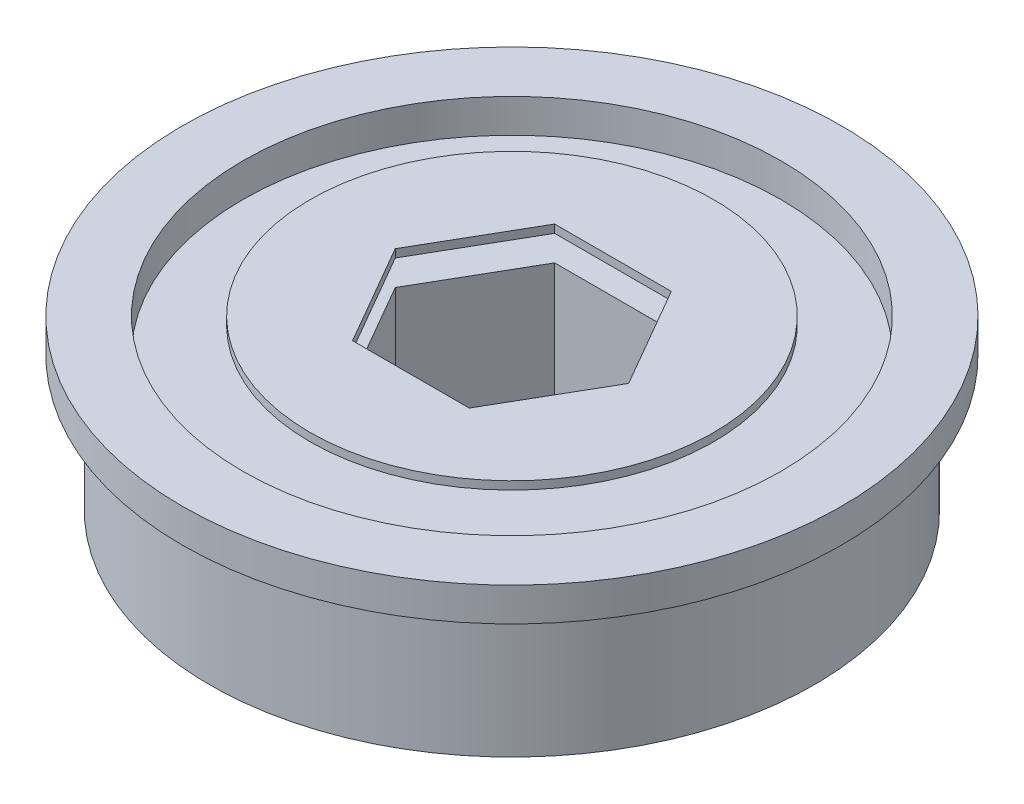
ISO-10303-21;
HEADER;
FILE_DESCRIPTION(('STEP AP214'),'2;1');
FILE_NAME('part.step','',(''),(''),'','','');
FILE_SCHEMA(('AUTOMOTIVE_DESIGN { 1 0 10303 214 1 1 1 1 }'));
ENDSEC;
DATA;
#1=APPLICATION_CONTEXT('core data for automotive mechanical design processes');
#2=APPLICATION_PROTOCOL_DEFINITION('international standard','automotive_design',2000,#1);
#3=PRODUCT_CONTEXT('',#1,'mechanical');
#4=PRODUCT('Part','Part','',(#3));
#5=PRODUCT_RELATED_PRODUCT_CATEGORY('part','',(#4));
#6=PRODUCT_DEFINITION_FORMATION('','',#4);
#7=PRODUCT_DEFINITION_CONTEXT('part definition',#1,'design');
#8=PRODUCT_DEFINITION('design','',#6,#7);
#9=PRODUCT_DEFINITION_SHAPE('','',#8);
#10=(LENGTH_UNIT() NAMED_UNIT(*) SI_UNIT(.MILLI.,.METRE.));
#11=(NAMED_UNIT(*) PLANE_ANGLE_UNIT() SI_UNIT($,.RADIAN.));
#12=(NAMED_UNIT(*) SI_UNIT($,.STERADIAN.) SOLID_ANGLE_UNIT());
#13=UNCERTAINTY_MEASURE_WITH_UNIT(LENGTH_MEASURE(1.E-05),#10,'distance_accuracy_value','');
#14=(GEOMETRIC_REPRESENTATION_CONTEXT(3) GLOBAL_UNCERTAINTY_ASSIGNED_CONTEXT((#13)) GLOBAL_UNIT_ASSIGNED_CONTEXT((#10,
#11,#12)) REPRESENTATION_CONTEXT('',''));
#15=CARTESIAN_POINT('',(0.,0.,0.));
#16=DIRECTION('',(0.,0.,1.));
#17=DIRECTION('',(1.,0.,0.));
#18=AXIS2_PLACEMENT_3D('',#15,#16,#17);
#19=CARTESIAN_POINT('',(0.,7.9375,0.));
#20=DIRECTION('',(0.,-1.,0.));
#21=DIRECTION('',(0.,0.,-1.));
#22=AXIS2_PLACEMENT_3D('',#19,#20,#21);
#23=CYLINDRICAL_SURFACE('',#22,9.525);
#24=CARTESIAN_POINT('',(0.,7.9375,0.));
#25=DIRECTION('',(0.,-1.,0.));
#26=DIRECTION('',(0.,0.,1.));
#27=AXIS2_PLACEMENT_3D('',#24,#25,#26);
#28=CIRCLE('',#27,9.525);
#29=CARTESIAN_POINT('',(0.,7.9375,9.525));
#30=VERTEX_POINT('',#29);
#31=EDGE_CURVE('E135',#30,#30,#28,.T.);
#32=ORIENTED_EDGE('',*,*,#31,.T.);
#33=EDGE_LOOP('',(#32));
#34=FACE_BOUND('',#33,.T.);
#35=CARTESIAN_POINT('',(0.,7.5565,0.));
#36=DIRECTION('',(0.,-1.,0.));
#37=DIRECTION('',(0.,0.,1.));
#38=AXIS2_PLACEMENT_3D('',#35,#36,#37);
#39=CIRCLE('',#38,9.525);
#40=CARTESIAN_POINT('',(0.,7.5565,9.525));
#41=VERTEX_POINT('',#40);
#42=EDGE_CURVE('E124',#41,#41,#39,.T.);
#43=ORIENTED_EDGE('',*,*,#42,.F.);
#44=EDGE_LOOP('',(#43));
#45=FACE_BOUND('',#44,.T.);
#46=ADVANCED_FACE('F43',(#34,#45),#23,.T.);
#47=CARTESIAN_POINT('',(0.,7.9375,0.));
#48=DIRECTION('',(0.,1.,0.));
#49=DIRECTION('',(0.,0.,1.));
#50=AXIS2_PLACEMENT_3D('',#47,#48,#49);
#51=PLANE('',#50);
#52=DIRECTION('',(-0.5,0.,-0.866025403784439));
#53=VECTOR('',#52,1.);
#54=CARTESIAN_POINT('',(-2.75396078403451,7.9375,4.77));
#55=LINE('',#54,#53);
#56=CARTESIAN_POINT('',(-2.75396078403451,7.9375,4.77));
#57=VERTEX_POINT('',#56);
#58=CARTESIAN_POINT('',(-5.50792156806903,7.9375,0.));
#59=VERTEX_POINT('',#58);
#60=EDGE_CURVE('E98',#57,#59,#55,.T.);
#61=ORIENTED_EDGE('',*,*,#60,.T.);
#62=DIRECTION('',(0.5,0.,-0.866025403784439));
#63=VECTOR('',#62,1.);
#64=CARTESIAN_POINT('',(-5.50792156806903,7.9375,0.));
#65=LINE('',#64,#63);
#66=CARTESIAN_POINT('',(-2.75396078403451,7.9375,-4.77));
#67=VERTEX_POINT('',#66);
#68=EDGE_CURVE('E105',#59,#67,#65,.T.);
#69=ORIENTED_EDGE('',*,*,#68,.T.);
#70=DIRECTION('',(1.,0.,0.));
#71=VECTOR('',#70,1.);
#72=CARTESIAN_POINT('',(-2.75396078403451,7.9375,-4.77));
#73=LINE('',#72,#71);
#74=CARTESIAN_POINT('',(2.75396078403452,7.9375,-4.77));
#75=VERTEX_POINT('',#74);
#76=EDGE_CURVE('E57',#67,#75,#73,.T.);
#77=ORIENTED_EDGE('',*,*,#76,.T.);
#78=DIRECTION('',(0.5,0.,0.866025403784439));
#79=VECTOR('',#78,1.);
#80=CARTESIAN_POINT('',(2.75396078403452,7.9375,-4.77));
#81=LINE('',#80,#79);
#82=CARTESIAN_POINT('',(5.50792156806903,7.9375,0.));
#83=VERTEX_POINT('',#82);
#84=EDGE_CURVE('E116',#75,#83,#81,.T.);
#85=ORIENTED_EDGE('',*,*,#84,.T.);
#86=DIRECTION('',(-0.5,0.,0.866025403784439));
#87=VECTOR('',#86,1.);
#88=CARTESIAN_POINT('',(5.50792156806903,7.9375,0.));
#89=LINE('',#88,#87);
#90=CARTESIAN_POINT('',(2.75396078403451,7.9375,4.77));
#91=VERTEX_POINT('',#90);
#92=EDGE_CURVE('E119',#83,#91,#89,.T.);
#93=ORIENTED_EDGE('',*,*,#92,.T.);
#94=DIRECTION('',(-1.,0.,0.));
#95=VECTOR('',#94,1.);
#96=CARTESIAN_POINT('',(2.75396078403451,7.9375,4.77));
#97=LINE('',#96,#95);
#98=EDGE_CURVE('E102',#91,#57,#97,.T.);
#99=ORIENTED_EDGE('',*,*,#98,.T.);
#100=EDGE_LOOP('',(#61,#69,#77,#85,#93,#99));
#101=FACE_BOUND('',#100,.T.);
#102=ORIENTED_EDGE('',*,*,#31,.F.);
#103=EDGE_LOOP('',(#102));
#104=FACE_BOUND('',#103,.T.);
#105=ADVANCED_FACE('F109',(#101,#104),#51,.T.);
#106=CARTESIAN_POINT('',(0.,7.5565,0.));
#107=DIRECTION('',(0.,1.,0.));
#108=DIRECTION('',(0.,0.,1.));
#109=AXIS2_PLACEMENT_3D('',#106,#107,#108);
#110=PLANE('',#109);
#111=DIRECTION('',(-0.5,0.,0.866025403784439));
#112=VECTOR('',#111,1.);
#113=CARTESIAN_POINT('',(-4.13094117605177,7.5565,-2.385));
#114=LINE('',#113,#112);
#115=CARTESIAN_POINT('',(-2.75396078403451,7.5565,-4.77));
#116=VERTEX_POINT('',#115);
#117=CARTESIAN_POINT('',(-5.50792156806903,7.5565,0.));
#118=VERTEX_POINT('',#117);
#119=EDGE_CURVE('E138',#116,#118,#114,.T.);
#120=ORIENTED_EDGE('',*,*,#119,.T.);
#121=DIRECTION('',(0.5,0.,0.866025403784439));
#122=VECTOR('',#121,1.);
#123=CARTESIAN_POINT('',(-4.13094117605177,7.5565,2.385));
#124=LINE('',#123,#122);
#125=CARTESIAN_POINT('',(-2.75396078403451,7.5565,4.77));
#126=VERTEX_POINT('',#125);
#127=EDGE_CURVE('E12',#118,#126,#124,.T.);
#128=ORIENTED_EDGE('',*,*,#127,.T.);
#129=DIRECTION('',(1.,0.,0.));
#130=VECTOR('',#129,1.);
#131=CARTESIAN_POINT('',(0.,7.5565,4.77));
#132=LINE('',#131,#130);
#133=CARTESIAN_POINT('',(2.75396078403451,7.5565,4.77));
#134=VERTEX_POINT('',#133);
#135=EDGE_CURVE('E50',#126,#134,#132,.T.);
#136=ORIENTED_EDGE('',*,*,#135,.T.);
#137=DIRECTION('',(0.5,0.,-0.866025403784439));
#138=VECTOR('',#137,1.);
#139=CARTESIAN_POINT('',(4.13094117605177,7.5565,2.385));
#140=LINE('',#139,#138);
#141=CARTESIAN_POINT('',(5.50792156806903,7.5565,0.));
#142=VERTEX_POINT('',#141);
#143=EDGE_CURVE('E148',#134,#142,#140,.T.);
#144=ORIENTED_EDGE('',*,*,#143,.T.);
#145=DIRECTION('',(-0.5,0.,-0.866025403784439));
#146=VECTOR('',#145,1.);
#147=CARTESIAN_POINT('',(4.13094117605177,7.5565,-2.385));
#148=LINE('',#147,#146);
#149=CARTESIAN_POINT('',(2.75396078403452,7.5565,-4.77));
#150=VERTEX_POINT('',#149);
#151=EDGE_CURVE('E145',#142,#150,#148,.T.);
#152=ORIENTED_EDGE('',*,*,#151,.T.);
#153=DIRECTION('',(-1.,0.,0.));
#154=VECTOR('',#153,1.);
#155=CARTESIAN_POINT('',(0.,7.5565,-4.77));
#156=LINE('',#155,#154);
#157=EDGE_CURVE('E142',#150,#116,#156,.T.);
#158=ORIENTED_EDGE('',*,*,#157,.T.);
#159=EDGE_LOOP('',(#120,#128,#136,#144,#152,#158));
#160=FACE_BOUND('',#159,.T.);
#161=ORIENTED_EDGE('',*,*,#42,.T.);
#162=EDGE_LOOP('',(#161));
#163=FACE_BOUND('',#162,.T.);
#164=ADVANCED_FACE('F152',(#160,#163),#110,.F.);
#165=CARTESIAN_POINT('',(-2.75396078403451,7.9375,4.77));
#166=DIRECTION('',(-0.866025403784439,0.,0.5));
#167=DIRECTION('',(0.5,0.,0.866025403784439));
#168=AXIS2_PLACEMENT_3D('',#165,#166,#167);
#169=PLANE('',#168);
#170=DIRECTION('',(0.,-1.,0.));
#171=VECTOR('',#170,1.);
#172=CARTESIAN_POINT('',(-5.50792156806903,7.9375,0.));
#173=LINE('',#172,#171);
#174=EDGE_CURVE('E65',#59,#118,#173,.T.);
#175=ORIENTED_EDGE('',*,*,#174,.F.);
#176=ORIENTED_EDGE('',*,*,#60,.F.);
#177=DIRECTION('',(0.,-1.,0.));
#178=VECTOR('',#177,1.);
#179=CARTESIAN_POINT('',(-2.75396078403451,7.9375,4.77));
#180=LINE('',#179,#178);
#181=EDGE_CURVE('E122',#57,#126,#180,.T.);
#182=ORIENTED_EDGE('',*,*,#181,.T.);
#183=ORIENTED_EDGE('',*,*,#127,.F.);
#184=EDGE_LOOP('',(#175,#176,#182,#183));
#185=FACE_BOUND('',#184,.T.);
#186=ADVANCED_FACE('F95',(#185),#169,.F.);
#187=CARTESIAN_POINT('',(2.75396078403451,7.9375,4.77));
#188=DIRECTION('',(0.,0.,1.));
#189=DIRECTION('',(1.,0.,0.));
#190=AXIS2_PLACEMENT_3D('',#187,#188,#189);
#191=PLANE('',#190);
#192=ORIENTED_EDGE('',*,*,#181,.F.);
#193=ORIENTED_EDGE('',*,*,#98,.F.);
#194=DIRECTION('',(0.,-1.,0.));
#195=VECTOR('',#194,1.);
#196=CARTESIAN_POINT('',(2.75396078403451,7.9375,4.77));
#197=LINE('',#196,#195);
#198=EDGE_CURVE('E125',#91,#134,#197,.T.);
#199=ORIENTED_EDGE('',*,*,#198,.T.);
#200=ORIENTED_EDGE('',*,*,#135,.F.);
#201=EDGE_LOOP('',(#192,#193,#199,#200));
#202=FACE_BOUND('',#201,.T.);
#203=ADVANCED_FACE('F155',(#202),#191,.F.);
#204=CARTESIAN_POINT('',(5.50792156806903,7.9375,0.));
#205=DIRECTION('',(0.866025403784439,0.,0.5));
#206=DIRECTION('',(0.5,0.,-0.866025403784439));
#207=AXIS2_PLACEMENT_3D('',#204,#205,#206);
#208=PLANE('',#207);
#209=ORIENTED_EDGE('',*,*,#198,.F.);
#210=ORIENTED_EDGE('',*,*,#92,.F.);
#211=DIRECTION('',(0.,-1.,0.));
#212=VECTOR('',#211,1.);
#213=CARTESIAN_POINT('',(5.50792156806903,7.9375,0.));
#214=LINE('',#213,#212);
#215=EDGE_CURVE('E128',#83,#142,#214,.T.);
#216=ORIENTED_EDGE('',*,*,#215,.T.);
#217=ORIENTED_EDGE('',*,*,#143,.F.);
#218=EDGE_LOOP('',(#209,#210,#216,#217));
#219=FACE_BOUND('',#218,.T.);
#220=ADVANCED_FACE('F158',(#219),#208,.F.);
#221=CARTESIAN_POINT('',(2.75396078403452,7.9375,-4.77));
#222=DIRECTION('',(0.866025403784439,0.,-0.5));
#223=DIRECTION('',(-0.5,0.,-0.866025403784439));
#224=AXIS2_PLACEMENT_3D('',#221,#222,#223);
#225=PLANE('',#224);
#226=ORIENTED_EDGE('',*,*,#215,.F.);
#227=ORIENTED_EDGE('',*,*,#84,.F.);
#228=DIRECTION('',(0.,-1.,0.));
#229=VECTOR('',#228,1.);
#230=CARTESIAN_POINT('',(2.75396078403452,7.9375,-4.77));
#231=LINE('',#230,#229);
#232=EDGE_CURVE('E131',#75,#150,#231,.T.);
#233=ORIENTED_EDGE('',*,*,#232,.T.);
#234=ORIENTED_EDGE('',*,*,#151,.F.);
#235=EDGE_LOOP('',(#226,#227,#233,#234));
#236=FACE_BOUND('',#235,.T.);
#237=ADVANCED_FACE('F161',(#236),#225,.F.);
#238=CARTESIAN_POINT('',(-2.75396078403451,7.9375,-4.77));
#239=DIRECTION('',(0.,0.,-1.));
#240=DIRECTION('',(-1.,0.,0.));
#241=AXIS2_PLACEMENT_3D('',#238,#239,#240);
#242=PLANE('',#241);
#243=ORIENTED_EDGE('',*,*,#232,.F.);
#244=ORIENTED_EDGE('',*,*,#76,.F.);
#245=DIRECTION('',(0.,-1.,0.));
#246=VECTOR('',#245,1.);
#247=CARTESIAN_POINT('',(-2.75396078403451,7.9375,-4.77));
#248=LINE('',#247,#246);
#249=EDGE_CURVE('E101',#67,#116,#248,.T.);
#250=ORIENTED_EDGE('',*,*,#249,.T.);
#251=ORIENTED_EDGE('',*,*,#157,.F.);
#252=EDGE_LOOP('',(#243,#244,#250,#251));
#253=FACE_BOUND('',#252,.T.);
#254=ADVANCED_FACE('F162',(#253),#242,.F.);
#255=CARTESIAN_POINT('',(-5.50792156806903,7.9375,0.));
#256=DIRECTION('',(-0.866025403784438,0.,-0.5));
#257=DIRECTION('',(-0.5,0.,0.866025403784439));
#258=AXIS2_PLACEMENT_3D('',#255,#256,#257);
#259=PLANE('',#258);
#260=ORIENTED_EDGE('',*,*,#249,.F.);
#261=ORIENTED_EDGE('',*,*,#68,.F.);
#262=ORIENTED_EDGE('',*,*,#174,.T.);
#263=ORIENTED_EDGE('',*,*,#119,.F.);
#264=EDGE_LOOP('',(#260,#261,#262,#263));
#265=FACE_BOUND('',#264,.T.);
#266=ADVANCED_FACE('F106',(#265),#259,.F.);
#267=CLOSED_SHELL('',(#46,#105,#164,#186,#203,#220,#237,#254,#266));
#268=MANIFOLD_SOLID_BREP('B2',#267);
#269=CARTESIAN_POINT('',(0.,6.35,0.));
#270=DIRECTION('',(0.,1.,0.));
#271=DIRECTION('',(0.,0.,1.));
#272=AXIS2_PLACEMENT_3D('',#269,#270,#271);
#273=CYLINDRICAL_SURFACE('',#272,15.5575);
#274=CARTESIAN_POINT('',(0.,6.35,0.));
#275=DIRECTION('',(0.,1.,0.));
#276=DIRECTION('',(0.,0.,1.));
#277=AXIS2_PLACEMENT_3D('',#274,#275,#276);
#278=CIRCLE('',#277,15.5575);
#279=CARTESIAN_POINT('',(0.,6.35,15.5575));
#280=VERTEX_POINT('',#279);
#281=EDGE_CURVE('E41',#280,#280,#278,.T.);
#282=ORIENTED_EDGE('',*,*,#281,.T.);
#283=EDGE_LOOP('',(#282));
#284=FACE_BOUND('',#283,.T.);
#285=CARTESIAN_POINT('',(0.,7.9375,0.));
#286=DIRECTION('',(0.,1.,0.));
#287=DIRECTION('',(0.,0.,1.));
#288=AXIS2_PLACEMENT_3D('',#285,#286,#287);
#289=CIRCLE('',#288,15.5575);
#290=CARTESIAN_POINT('',(0.,7.9375,15.5575));
#291=VERTEX_POINT('',#290);
#292=EDGE_CURVE('E247',#291,#291,#289,.T.);
#293=ORIENTED_EDGE('',*,*,#292,.F.);
#294=EDGE_LOOP('',(#293));
#295=FACE_BOUND('',#294,.T.);
#296=ADVANCED_FACE('F240',(#284,#295),#273,.T.);
#297=CARTESIAN_POINT('',(15.5575,6.35,0.));
#298=DIRECTION('',(0.,-1.,0.));
#299=DIRECTION('',(0.,0.,-1.));
#300=AXIS2_PLACEMENT_3D('',#297,#298,#299);
#301=PLANE('',#300);
#302=CARTESIAN_POINT('',(0.,6.35,0.));
#303=DIRECTION('',(0.,-1.,0.));
#304=DIRECTION('',(0.,0.,-1.));
#305=AXIS2_PLACEMENT_3D('',#302,#303,#304);
#306=CIRCLE('',#305,14.2748);
#307=CARTESIAN_POINT('',(0.,6.35,-14.2748));
#308=VERTEX_POINT('',#307);
#309=EDGE_CURVE('E346',#308,#308,#306,.T.);
#310=ORIENTED_EDGE('',*,*,#309,.F.);
#311=EDGE_LOOP('',(#310));
#312=FACE_BOUND('',#311,.T.);
#313=ORIENTED_EDGE('',*,*,#281,.F.);
#314=EDGE_LOOP('',(#313));
#315=FACE_BOUND('',#314,.T.);
#316=ADVANCED_FACE('F363',(#312,#315),#301,.T.);
#317=CARTESIAN_POINT('',(0.,7.9375,0.));
#318=DIRECTION('',(0.,1.,0.));
#319=DIRECTION('',(0.,0.,1.));
#320=AXIS2_PLACEMENT_3D('',#317,#318,#319);
#321=PLANE('',#320);
#322=CARTESIAN_POINT('',(0.,7.9375,0.));
#323=DIRECTION('',(0.,1.,0.));
#324=DIRECTION('',(0.,0.,1.));
#325=AXIS2_PLACEMENT_3D('',#322,#323,#324);
#326=CIRCLE('',#325,12.7);
#327=CARTESIAN_POINT('',(0.,7.9375,12.7));
#328=VERTEX_POINT('',#327);
#329=EDGE_CURVE('E350',#328,#328,#326,.T.);
#330=ORIENTED_EDGE('',*,*,#329,.F.);
#331=EDGE_LOOP('',(#330));
#332=FACE_BOUND('',#331,.T.);
#333=ORIENTED_EDGE('',*,*,#292,.T.);
#334=EDGE_LOOP('',(#333));
#335=FACE_BOUND('',#334,.T.);
#336=ADVANCED_FACE('F360',(#332,#335),#321,.T.);
#337=CARTESIAN_POINT('',(0.,7.9375,0.));
#338=DIRECTION('',(0.,1.,0.));
#339=DIRECTION('',(0.,0.,1.));
#340=AXIS2_PLACEMENT_3D('',#337,#338,#339);
#341=CYLINDRICAL_SURFACE('',#340,12.7);
#342=CARTESIAN_POINT('',(0.,6.34999999999999,0.));
#343=DIRECTION('',(0.,1.,0.));
#344=DIRECTION('',(0.,0.,1.));
#345=AXIS2_PLACEMENT_3D('',#342,#343,#344);
#346=CIRCLE('',#345,12.7);
#347=CARTESIAN_POINT('',(0.,6.34999999999999,12.7));
#348=VERTEX_POINT('',#347);
#349=EDGE_CURVE('E355',#348,#348,#346,.T.);
#350=ORIENTED_EDGE('',*,*,#349,.F.);
#351=EDGE_LOOP('',(#350));
#352=FACE_BOUND('',#351,.T.);
#353=ORIENTED_EDGE('',*,*,#329,.T.);
#354=EDGE_LOOP('',(#353));
#355=FACE_BOUND('',#354,.T.);
#356=ADVANCED_FACE('F374',(#352,#355),#341,.F.);
#357=CARTESIAN_POINT('',(0.,6.35,0.));
#358=DIRECTION('',(0.,-1.,0.));
#359=DIRECTION('',(0.,0.,-1.));
#360=AXIS2_PLACEMENT_3D('',#357,#358,#359);
#361=PLANE('',#360);
#362=DIRECTION('',(-1.,0.,0.));
#363=VECTOR('',#362,1.);
#364=CARTESIAN_POINT('',(0.,6.35,4.77));
#365=LINE('',#364,#363);
#366=CARTESIAN_POINT('',(2.75396078403451,6.35,4.77));
#367=VERTEX_POINT('',#366);
#368=CARTESIAN_POINT('',(-2.75396078403451,6.35,4.77));
#369=VERTEX_POINT('',#368);
#370=EDGE_CURVE('E340',#367,#369,#365,.T.);
#371=ORIENTED_EDGE('',*,*,#370,.T.);
#372=DIRECTION('',(-0.5,0.,-0.866025403784439));
#373=VECTOR('',#372,1.);
#374=CARTESIAN_POINT('',(-4.13094117605177,6.35,2.385));
#375=LINE('',#374,#373);
#376=CARTESIAN_POINT('',(-5.50792156806903,6.35,0.));
#377=VERTEX_POINT('',#376);
#378=EDGE_CURVE('E343',#369,#377,#375,.T.);
#379=ORIENTED_EDGE('',*,*,#378,.T.);
#380=DIRECTION('',(0.5,0.,-0.866025403784439));
#381=VECTOR('',#380,1.);
#382=CARTESIAN_POINT('',(-4.13094117605177,6.35,-2.385));
#383=LINE('',#382,#381);
#384=CARTESIAN_POINT('',(-2.75396078403451,6.35,-4.77));
#385=VERTEX_POINT('',#384);
#386=EDGE_CURVE('E325',#377,#385,#383,.T.);
#387=ORIENTED_EDGE('',*,*,#386,.T.);
#388=DIRECTION('',(1.,0.,0.));
#389=VECTOR('',#388,1.);
#390=CARTESIAN_POINT('',(0.,6.35,-4.77));
#391=LINE('',#390,#389);
#392=CARTESIAN_POINT('',(2.75396078403452,6.35,-4.77));
#393=VERTEX_POINT('',#392);
#394=EDGE_CURVE('E298',#385,#393,#391,.T.);
#395=ORIENTED_EDGE('',*,*,#394,.T.);
#396=DIRECTION('',(0.5,0.,0.866025403784439));
#397=VECTOR('',#396,1.);
#398=CARTESIAN_POINT('',(4.13094117605177,6.35,-2.385));
#399=LINE('',#398,#397);
#400=CARTESIAN_POINT('',(5.50792156806903,6.35,0.));
#401=VERTEX_POINT('',#400);
#402=EDGE_CURVE('E334',#393,#401,#399,.T.);
#403=ORIENTED_EDGE('',*,*,#402,.T.);
#404=DIRECTION('',(-0.5,0.,0.866025403784439));
#405=VECTOR('',#404,1.);
#406=CARTESIAN_POINT('',(4.13094117605177,6.35,2.385));
#407=LINE('',#406,#405);
#408=EDGE_CURVE('E337',#401,#367,#407,.T.);
#409=ORIENTED_EDGE('',*,*,#408,.T.);
#410=EDGE_LOOP('',(#371,#379,#387,#395,#403,#409));
#411=FACE_BOUND('',#410,.T.);
#412=ORIENTED_EDGE('',*,*,#349,.T.);
#413=EDGE_LOOP('',(#412));
#414=FACE_BOUND('',#413,.T.);
#415=ADVANCED_FACE('F381',(#411,#414),#361,.F.);
#416=CARTESIAN_POINT('',(0.,0.,0.));
#417=DIRECTION('',(0.,1.,0.));
#418=DIRECTION('',(0.,0.,1.));
#419=AXIS2_PLACEMENT_3D('',#416,#417,#418);
#420=CYLINDRICAL_SURFACE('',#419,14.2748);
#421=CARTESIAN_POINT('',(0.,0.,0.));
#422=DIRECTION('',(0.,-1.,0.));
#423=DIRECTION('',(0.,0.,-1.));
#424=AXIS2_PLACEMENT_3D('',#421,#422,#423);
#425=CIRCLE('',#424,14.2748);
#426=CARTESIAN_POINT('',(0.,0.,-14.2748));
#427=VERTEX_POINT('',#426);
#428=EDGE_CURVE('E347',#427,#427,#425,.T.);
#429=ORIENTED_EDGE('',*,*,#428,.F.);
#430=EDGE_LOOP('',(#429));
#431=FACE_BOUND('',#430,.T.);
#432=ORIENTED_EDGE('',*,*,#309,.T.);
#433=EDGE_LOOP('',(#432));
#434=FACE_BOUND('',#433,.T.);
#435=ADVANCED_FACE('F383',(#431,#434),#420,.T.);
#436=CARTESIAN_POINT('',(0.,0.,0.));
#437=DIRECTION('',(0.,-1.,0.));
#438=DIRECTION('',(0.,0.,-1.));
#439=AXIS2_PLACEMENT_3D('',#436,#437,#438);
#440=PLANE('',#439);
#441=DIRECTION('',(-0.5,0.,-0.866025403784439));
#442=VECTOR('',#441,1.);
#443=CARTESIAN_POINT('',(-2.75396078403451,0.,4.77));
#444=LINE('',#443,#442);
#445=CARTESIAN_POINT('',(-2.75396078403451,0.,4.77));
#446=VERTEX_POINT('',#445);
#447=CARTESIAN_POINT('',(-5.50792156806903,0.,0.));
#448=VERTEX_POINT('',#447);
#449=EDGE_CURVE('E262',#446,#448,#444,.T.);
#450=ORIENTED_EDGE('',*,*,#449,.F.);
#451=DIRECTION('',(-1.,0.,0.));
#452=VECTOR('',#451,1.);
#453=CARTESIAN_POINT('',(2.75396078403451,0.,4.77));
#454=LINE('',#453,#452);
#455=CARTESIAN_POINT('',(2.75396078403451,0.,4.77));
#456=VERTEX_POINT('',#455);
#457=EDGE_CURVE('E320',#456,#446,#454,.T.);
#458=ORIENTED_EDGE('',*,*,#457,.F.);
#459=DIRECTION('',(-0.5,0.,0.866025403784439));
#460=VECTOR('',#459,1.);
#461=CARTESIAN_POINT('',(5.50792156806903,0.,0.));
#462=LINE('',#461,#460);
#463=CARTESIAN_POINT('',(5.50792156806903,0.,0.));
#464=VERTEX_POINT('',#463);
#465=EDGE_CURVE('E314',#464,#456,#462,.T.);
#466=ORIENTED_EDGE('',*,*,#465,.F.);
#467=DIRECTION('',(0.5,0.,0.866025403784439));
#468=VECTOR('',#467,1.);
#469=CARTESIAN_POINT('',(2.75396078403452,0.,-4.77));
#470=LINE('',#469,#468);
#471=CARTESIAN_POINT('',(2.75396078403452,0.,-4.77));
#472=VERTEX_POINT('',#471);
#473=EDGE_CURVE('E312',#472,#464,#470,.T.);
#474=ORIENTED_EDGE('',*,*,#473,.F.);
#475=DIRECTION('',(1.,0.,0.));
#476=VECTOR('',#475,1.);
#477=CARTESIAN_POINT('',(-2.75396078403451,0.,-4.77));
#478=LINE('',#477,#476);
#479=CARTESIAN_POINT('',(-2.75396078403451,0.,-4.77));
#480=VERTEX_POINT('',#479);
#481=EDGE_CURVE('E295',#480,#472,#478,.T.);
#482=ORIENTED_EDGE('',*,*,#481,.F.);
#483=DIRECTION('',(0.5,0.,-0.866025403784439));
#484=VECTOR('',#483,1.);
#485=CARTESIAN_POINT('',(-5.50792156806903,0.,0.));
#486=LINE('',#485,#484);
#487=EDGE_CURVE('E304',#448,#480,#486,.T.);
#488=ORIENTED_EDGE('',*,*,#487,.F.);
#489=EDGE_LOOP('',(#450,#458,#466,#474,#482,#488));
#490=FACE_BOUND('',#489,.T.);
#491=ORIENTED_EDGE('',*,*,#428,.T.);
#492=EDGE_LOOP('',(#491));
#493=FACE_BOUND('',#492,.T.);
#494=ADVANCED_FACE('F308',(#490,#493),#440,.T.);
#495=CARTESIAN_POINT('',(-2.75396078403451,7.9375,4.77));
#496=DIRECTION('',(-0.866025403784439,0.,0.5));
#497=DIRECTION('',(0.5,0.,0.866025403784439));
#498=AXIS2_PLACEMENT_3D('',#495,#496,#497);
#499=PLANE('',#498);
#500=DIRECTION('',(0.,-1.,0.));
#501=VECTOR('',#500,1.);
#502=CARTESIAN_POINT('',(-2.75396078403451,7.9375,4.77));
#503=LINE('',#502,#501);
#504=EDGE_CURVE('E323',#369,#446,#503,.T.);
#505=ORIENTED_EDGE('',*,*,#504,.T.);
#506=ORIENTED_EDGE('',*,*,#449,.T.);
#507=DIRECTION('',(0.,-1.,0.));
#508=VECTOR('',#507,1.);
#509=CARTESIAN_POINT('',(-5.50792156806903,7.9375,0.));
#510=LINE('',#509,#508);
#511=EDGE_CURVE('E301',#377,#448,#510,.T.);
#512=ORIENTED_EDGE('',*,*,#511,.F.);
#513=ORIENTED_EDGE('',*,*,#378,.F.);
#514=EDGE_LOOP('',(#505,#506,#512,#513));
#515=FACE_BOUND('',#514,.T.);
#516=ADVANCED_FACE('F392',(#515),#499,.F.);
#517=CARTESIAN_POINT('',(2.75396078403451,7.9375,4.77));
#518=DIRECTION('',(0.,0.,1.));
#519=DIRECTION('',(1.,0.,0.));
#520=AXIS2_PLACEMENT_3D('',#517,#518,#519);
#521=PLANE('',#520);
#522=DIRECTION('',(0.,-1.,0.));
#523=VECTOR('',#522,1.);
#524=CARTESIAN_POINT('',(2.75396078403451,7.9375,4.77));
#525=LINE('',#524,#523);
#526=EDGE_CURVE('E326',#367,#456,#525,.T.);
#527=ORIENTED_EDGE('',*,*,#526,.T.);
#528=ORIENTED_EDGE('',*,*,#457,.T.);
#529=ORIENTED_EDGE('',*,*,#504,.F.);
#530=ORIENTED_EDGE('',*,*,#370,.F.);
#531=EDGE_LOOP('',(#527,#528,#529,#530));
#532=FACE_BOUND('',#531,.T.);
#533=ADVANCED_FACE('F395',(#532),#521,.F.);
#534=CARTESIAN_POINT('',(5.50792156806903,7.9375,0.));
#535=DIRECTION('',(0.866025403784439,0.,0.5));
#536=DIRECTION('',(0.5,0.,-0.866025403784439));
#537=AXIS2_PLACEMENT_3D('',#534,#535,#536);
#538=PLANE('',#537);
#539=DIRECTION('',(0.,-1.,0.));
#540=VECTOR('',#539,1.);
#541=CARTESIAN_POINT('',(5.50792156806903,7.9375,0.));
#542=LINE('',#541,#540);
#543=EDGE_CURVE('E328',#401,#464,#542,.T.);
#544=ORIENTED_EDGE('',*,*,#543,.T.);
#545=ORIENTED_EDGE('',*,*,#465,.T.);
#546=ORIENTED_EDGE('',*,*,#526,.F.);
#547=ORIENTED_EDGE('',*,*,#408,.F.);
#548=EDGE_LOOP('',(#544,#545,#546,#547));
#549=FACE_BOUND('',#548,.T.);
#550=ADVANCED_FACE('F403',(#549),#538,.F.);
#551=CARTESIAN_POINT('',(2.75396078403452,7.9375,-4.77));
#552=DIRECTION('',(0.866025403784439,0.,-0.5));
#553=DIRECTION('',(-0.5,0.,-0.866025403784439));
#554=AXIS2_PLACEMENT_3D('',#551,#552,#553);
#555=PLANE('',#554);
#556=DIRECTION('',(0.,-1.,0.));
#557=VECTOR('',#556,1.);
#558=CARTESIAN_POINT('',(2.75396078403452,7.9375,-4.77));
#559=LINE('',#558,#557);
#560=EDGE_CURVE('E300',#393,#472,#559,.T.);
#561=ORIENTED_EDGE('',*,*,#560,.T.);
#562=ORIENTED_EDGE('',*,*,#473,.T.);
#563=ORIENTED_EDGE('',*,*,#543,.F.);
#564=ORIENTED_EDGE('',*,*,#402,.F.);
#565=EDGE_LOOP('',(#561,#562,#563,#564));
#566=FACE_BOUND('',#565,.T.);
#567=ADVANCED_FACE('F400',(#566),#555,.F.);
#568=CARTESIAN_POINT('',(-2.75396078403451,7.9375,-4.77));
#569=DIRECTION('',(0.,0.,-1.));
#570=DIRECTION('',(-1.,0.,0.));
#571=AXIS2_PLACEMENT_3D('',#568,#569,#570);
#572=PLANE('',#571);
#573=DIRECTION('',(0.,-1.,0.));
#574=VECTOR('',#573,1.);
#575=CARTESIAN_POINT('',(-2.75396078403451,7.9375,-4.77));
#576=LINE('',#575,#574);
#577=EDGE_CURVE('E254',#385,#480,#576,.T.);
#578=ORIENTED_EDGE('',*,*,#577,.T.);
#579=ORIENTED_EDGE('',*,*,#481,.T.);
#580=ORIENTED_EDGE('',*,*,#560,.F.);
#581=ORIENTED_EDGE('',*,*,#394,.F.);
#582=EDGE_LOOP('',(#578,#579,#580,#581));
#583=FACE_BOUND('',#582,.T.);
#584=ADVANCED_FACE('F292',(#583),#572,.F.);
#585=CARTESIAN_POINT('',(-5.50792156806903,7.9375,0.));
#586=DIRECTION('',(-0.866025403784438,0.,-0.5));
#587=DIRECTION('',(-0.5,0.,0.866025403784439));
#588=AXIS2_PLACEMENT_3D('',#585,#586,#587);
#589=PLANE('',#588);
#590=ORIENTED_EDGE('',*,*,#511,.T.);
#591=ORIENTED_EDGE('',*,*,#487,.T.);
#592=ORIENTED_EDGE('',*,*,#577,.F.);
#593=ORIENTED_EDGE('',*,*,#386,.F.);
#594=EDGE_LOOP('',(#590,#591,#592,#593));
#595=FACE_BOUND('',#594,.T.);
#596=ADVANCED_FACE('F305',(#595),#589,.F.);
#597=CLOSED_SHELL('',(#296,#316,#336,#356,#415,#435,#494,#516,#533,#550,#567,#584,#596));
#598=MANIFOLD_SOLID_BREP('B6',#597);
#599=ADVANCED_BREP_SHAPE_REPRESENTATION('',(#18,#268,#598),#14);
#600=SHAPE_DEFINITION_REPRESENTATION(#9,#599);
ENDSEC;
END-ISO-10303-21;
